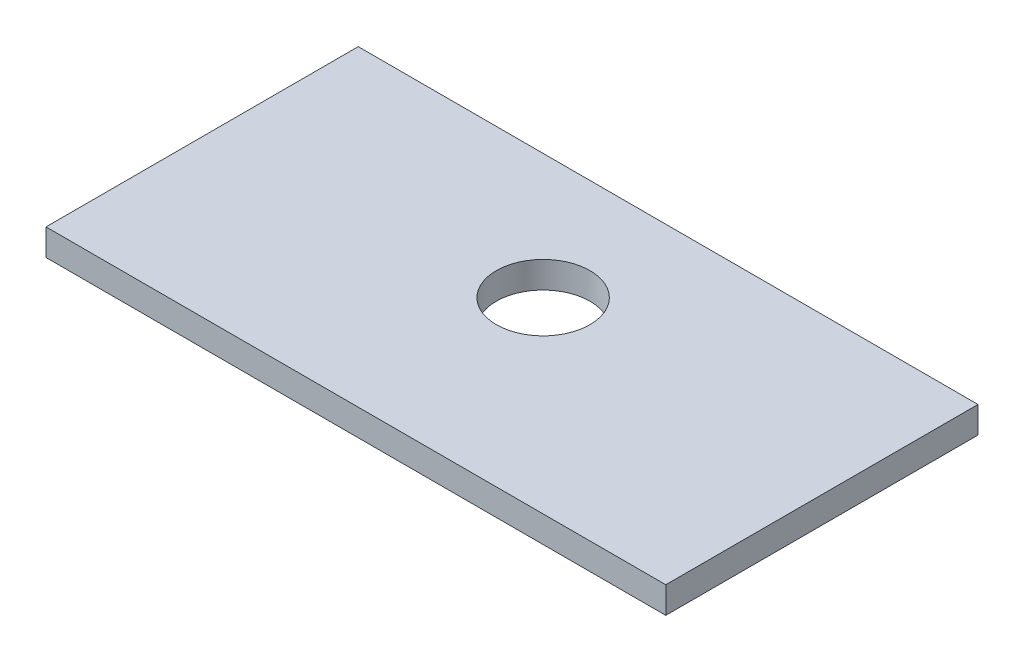
ISO-10303-21;
HEADER;
FILE_DESCRIPTION(('STEP AP214'),'2;1');
FILE_NAME('part.step','',(''),(''),'','','');
FILE_SCHEMA(('AUTOMOTIVE_DESIGN { 1 0 10303 214 1 1 1 1 }'));
ENDSEC;
DATA;
#1=APPLICATION_CONTEXT('core data for automotive mechanical design processes');
#2=APPLICATION_PROTOCOL_DEFINITION('international standard','automotive_design',2000,#1);
#3=PRODUCT_CONTEXT('',#1,'mechanical');
#4=PRODUCT('Part','Part','',(#3));
#5=PRODUCT_RELATED_PRODUCT_CATEGORY('part','',(#4));
#6=PRODUCT_DEFINITION_FORMATION('','',#4);
#7=PRODUCT_DEFINITION_CONTEXT('part definition',#1,'design');
#8=PRODUCT_DEFINITION('design','',#6,#7);
#9=PRODUCT_DEFINITION_SHAPE('','',#8);
#10=(LENGTH_UNIT() NAMED_UNIT(*) SI_UNIT(.MILLI.,.METRE.));
#11=(NAMED_UNIT(*) PLANE_ANGLE_UNIT() SI_UNIT($,.RADIAN.));
#12=(NAMED_UNIT(*) SI_UNIT($,.STERADIAN.) SOLID_ANGLE_UNIT());
#13=UNCERTAINTY_MEASURE_WITH_UNIT(LENGTH_MEASURE(1.E-05),#10,'distance_accuracy_value','');
#14=(GEOMETRIC_REPRESENTATION_CONTEXT(3) GLOBAL_UNCERTAINTY_ASSIGNED_CONTEXT((#13)) GLOBAL_UNIT_ASSIGNED_CONTEXT((#10,
#11,#12)) REPRESENTATION_CONTEXT('',''));
#15=CARTESIAN_POINT('',(0.,0.,0.));
#16=DIRECTION('',(0.,0.,1.));
#17=DIRECTION('',(1.,0.,0.));
#18=AXIS2_PLACEMENT_3D('',#15,#16,#17);
#19=CARTESIAN_POINT('',(-54.4857823610688,43.4768840682576,-25.));
#20=DIRECTION('',(-1.,0.,0.));
#21=DIRECTION('',(0.,0.,1.));
#22=AXIS2_PLACEMENT_3D('',#19,#20,#21);
#23=PLANE('',#22);
#24=DIRECTION('',(0.,-1.,0.));
#25=VECTOR('',#24,1.);
#26=CARTESIAN_POINT('',(-54.4857823610688,43.4768840682576,25.));
#27=LINE('',#26,#25);
#28=CARTESIAN_POINT('',(-54.4857823610688,43.4768840682576,25.));
#29=VERTEX_POINT('',#28);
#30=CARTESIAN_POINT('',(-54.4857823610688,39.2268840682576,25.));
#31=VERTEX_POINT('',#30);
#32=EDGE_CURVE('E108',#29,#31,#27,.T.);
#33=ORIENTED_EDGE('',*,*,#32,.F.);
#34=DIRECTION('',(0.,0.,1.));
#35=VECTOR('',#34,1.);
#36=CARTESIAN_POINT('',(-54.4857823610688,43.4768840682576,-25.));
#37=LINE('',#36,#35);
#38=CARTESIAN_POINT('',(-54.4857823610688,43.4768840682576,-25.));
#39=VERTEX_POINT('',#38);
#40=EDGE_CURVE('E11',#39,#29,#37,.T.);
#41=ORIENTED_EDGE('',*,*,#40,.F.);
#42=DIRECTION('',(0.,-1.,0.));
#43=VECTOR('',#42,1.);
#44=CARTESIAN_POINT('',(-54.4857823610688,43.4768840682576,-25.));
#45=LINE('',#44,#43);
#46=CARTESIAN_POINT('',(-54.4857823610688,39.2268840682576,-25.));
#47=VERTEX_POINT('',#46);
#48=EDGE_CURVE('E101',#39,#47,#45,.T.);
#49=ORIENTED_EDGE('',*,*,#48,.T.);
#50=DIRECTION('',(0.,0.,1.));
#51=VECTOR('',#50,1.);
#52=CARTESIAN_POINT('',(-54.4857823610688,39.2268840682576,-25.));
#53=LINE('',#52,#51);
#54=EDGE_CURVE('E84',#47,#31,#53,.T.);
#55=ORIENTED_EDGE('',*,*,#54,.T.);
#56=EDGE_LOOP('',(#33,#41,#49,#55));
#57=FACE_BOUND('',#56,.T.);
#58=ADVANCED_FACE('F41',(#57),#23,.T.);
#59=CARTESIAN_POINT('',(-54.4857823610688,43.4768840682576,-25.));
#60=DIRECTION('',(0.,1.,0.));
#61=DIRECTION('',(0.,0.,1.));
#62=AXIS2_PLACEMENT_3D('',#59,#60,#61);
#63=PLANE('',#62);
#64=CARTESIAN_POINT('',(-4.86927506307195,43.4768840682576,-4.99603155309754));
#65=DIRECTION('',(0.,1.,0.));
#66=DIRECTION('',(0.,0.,1.));
#67=AXIS2_PLACEMENT_3D('',#64,#65,#66);
#68=CIRCLE('',#67,7.5);
#69=CARTESIAN_POINT('',(-4.86927506307195,43.4768840682576,2.50396844690246));
#70=VERTEX_POINT('',#69);
#71=EDGE_CURVE('E140',#70,#70,#68,.T.);
#72=ORIENTED_EDGE('',*,*,#71,.F.);
#73=EDGE_LOOP('',(#72));
#74=FACE_BOUND('',#73,.T.);
#75=DIRECTION('',(-1.,0.,0.));
#76=VECTOR('',#75,1.);
#77=CARTESIAN_POINT('',(-54.4857823610688,43.4768840682576,25.));
#78=LINE('',#77,#76);
#79=CARTESIAN_POINT('',(44.7642176389312,43.4768840682576,25.));
#80=VERTEX_POINT('',#79);
#81=EDGE_CURVE('E103',#80,#29,#78,.T.);
#82=ORIENTED_EDGE('',*,*,#81,.F.);
#83=DIRECTION('',(0.,0.,1.));
#84=VECTOR('',#83,1.);
#85=CARTESIAN_POINT('',(44.7642176389312,43.4768840682576,-25.));
#86=LINE('',#85,#84);
#87=CARTESIAN_POINT('',(44.7642176389312,43.4768840682576,-25.));
#88=VERTEX_POINT('',#87);
#89=EDGE_CURVE('E50',#88,#80,#86,.T.);
#90=ORIENTED_EDGE('',*,*,#89,.F.);
#91=DIRECTION('',(-1.,0.,0.));
#92=VECTOR('',#91,1.);
#93=CARTESIAN_POINT('',(-54.4857823610688,43.4768840682576,-25.));
#94=LINE('',#93,#92);
#95=EDGE_CURVE('E98',#88,#39,#94,.T.);
#96=ORIENTED_EDGE('',*,*,#95,.T.);
#97=ORIENTED_EDGE('',*,*,#40,.T.);
#98=EDGE_LOOP('',(#82,#90,#96,#97));
#99=FACE_BOUND('',#98,.T.);
#100=ADVANCED_FACE('F118',(#74,#99),#63,.T.);
#101=CARTESIAN_POINT('',(44.7642176389312,43.4768840682576,-25.));
#102=DIRECTION('',(1.,0.,0.));
#103=DIRECTION('',(0.,0.,-1.));
#104=AXIS2_PLACEMENT_3D('',#101,#102,#103);
#105=PLANE('',#104);
#106=DIRECTION('',(0.,1.,0.));
#107=VECTOR('',#106,1.);
#108=CARTESIAN_POINT('',(44.7642176389312,43.4768840682576,25.));
#109=LINE('',#108,#107);
#110=CARTESIAN_POINT('',(44.7642176389312,39.2268840682576,25.));
#111=VERTEX_POINT('',#110);
#112=EDGE_CURVE('E92',#111,#80,#109,.T.);
#113=ORIENTED_EDGE('',*,*,#112,.F.);
#114=DIRECTION('',(0.,0.,1.));
#115=VECTOR('',#114,1.);
#116=CARTESIAN_POINT('',(44.7642176389312,39.2268840682576,-25.));
#117=LINE('',#116,#115);
#118=CARTESIAN_POINT('',(44.7642176389312,39.2268840682576,-25.));
#119=VERTEX_POINT('',#118);
#120=EDGE_CURVE('E87',#119,#111,#117,.T.);
#121=ORIENTED_EDGE('',*,*,#120,.F.);
#122=DIRECTION('',(0.,1.,0.));
#123=VECTOR('',#122,1.);
#124=CARTESIAN_POINT('',(44.7642176389312,43.4768840682576,-25.));
#125=LINE('',#124,#123);
#126=EDGE_CURVE('E90',#119,#88,#125,.T.);
#127=ORIENTED_EDGE('',*,*,#126,.T.);
#128=ORIENTED_EDGE('',*,*,#89,.T.);
#129=EDGE_LOOP('',(#113,#121,#127,#128));
#130=FACE_BOUND('',#129,.T.);
#131=ADVANCED_FACE('F89',(#130),#105,.T.);
#132=CARTESIAN_POINT('',(-54.4857823610688,39.2268840682576,-25.));
#133=DIRECTION('',(0.,-1.,0.));
#134=DIRECTION('',(0.,0.,-1.));
#135=AXIS2_PLACEMENT_3D('',#132,#133,#134);
#136=PLANE('',#135);
#137=CARTESIAN_POINT('',(-4.86927506307195,39.2268840682576,-4.99603155309754));
#138=DIRECTION('',(0.,-1.,0.));
#139=DIRECTION('',(0.,0.,-1.));
#140=AXIS2_PLACEMENT_3D('',#137,#138,#139);
#141=CIRCLE('',#140,7.5);
#142=CARTESIAN_POINT('',(-4.86927506307195,39.2268840682576,-12.4960315530975));
#143=VERTEX_POINT('',#142);
#144=EDGE_CURVE('E44',#143,#143,#141,.T.);
#145=ORIENTED_EDGE('',*,*,#144,.F.);
#146=EDGE_LOOP('',(#145));
#147=FACE_BOUND('',#146,.T.);
#148=DIRECTION('',(1.,0.,0.));
#149=VECTOR('',#148,1.);
#150=CARTESIAN_POINT('',(-54.4857823610688,39.2268840682576,25.));
#151=LINE('',#150,#149);
#152=EDGE_CURVE('E111',#31,#111,#151,.T.);
#153=ORIENTED_EDGE('',*,*,#152,.F.);
#154=ORIENTED_EDGE('',*,*,#54,.F.);
#155=DIRECTION('',(1.,0.,0.));
#156=VECTOR('',#155,1.);
#157=CARTESIAN_POINT('',(-54.4857823610688,39.2268840682576,-25.));
#158=LINE('',#157,#156);
#159=EDGE_CURVE('E97',#47,#119,#158,.T.);
#160=ORIENTED_EDGE('',*,*,#159,.T.);
#161=ORIENTED_EDGE('',*,*,#120,.T.);
#162=EDGE_LOOP('',(#153,#154,#160,#161));
#163=FACE_BOUND('',#162,.T.);
#164=ADVANCED_FACE('F100',(#147,#163),#136,.T.);
#165=CARTESIAN_POINT('',(0.,0.,-25.));
#166=DIRECTION('',(0.,0.,1.));
#167=DIRECTION('',(1.,0.,0.));
#168=AXIS2_PLACEMENT_3D('',#165,#166,#167);
#169=PLANE('',#168);
#170=ORIENTED_EDGE('',*,*,#48,.F.);
#171=ORIENTED_EDGE('',*,*,#95,.F.);
#172=ORIENTED_EDGE('',*,*,#126,.F.);
#173=ORIENTED_EDGE('',*,*,#159,.F.);
#174=EDGE_LOOP('',(#170,#171,#172,#173));
#175=FACE_BOUND('',#174,.T.);
#176=ADVANCED_FACE('F96',(#175),#169,.F.);
#177=CARTESIAN_POINT('',(0.,0.,25.));
#178=DIRECTION('',(0.,0.,1.));
#179=DIRECTION('',(1.,0.,0.));
#180=AXIS2_PLACEMENT_3D('',#177,#178,#179);
#181=PLANE('',#180);
#182=ORIENTED_EDGE('',*,*,#32,.T.);
#183=ORIENTED_EDGE('',*,*,#152,.T.);
#184=ORIENTED_EDGE('',*,*,#112,.T.);
#185=ORIENTED_EDGE('',*,*,#81,.T.);
#186=EDGE_LOOP('',(#182,#183,#184,#185));
#187=FACE_BOUND('',#186,.T.);
#188=ADVANCED_FACE('F117',(#187),#181,.T.);
#189=CARTESIAN_POINT('',(-4.86927506307195,37.4768840682576,-4.99603155309754));
#190=DIRECTION('',(0.,1.,0.));
#191=DIRECTION('',(0.,0.,1.));
#192=AXIS2_PLACEMENT_3D('',#189,#190,#191);
#193=CYLINDRICAL_SURFACE('',#192,7.5);
#194=ORIENTED_EDGE('',*,*,#144,.T.);
#195=EDGE_LOOP('',(#194));
#196=FACE_BOUND('',#195,.T.);
#197=ORIENTED_EDGE('',*,*,#71,.T.);
#198=EDGE_LOOP('',(#197));
#199=FACE_BOUND('',#198,.T.);
#200=ADVANCED_FACE('F143',(#196,#199),#193,.F.);
#201=CLOSED_SHELL('',(#58,#100,#131,#164,#176,#188,#200));
#202=MANIFOLD_SOLID_BREP('B2',#201);
#203=ADVANCED_BREP_SHAPE_REPRESENTATION('',(#18,#202),#14);
#204=SHAPE_DEFINITION_REPRESENTATION(#9,#203);
ENDSEC;
END-ISO-10303-21;
